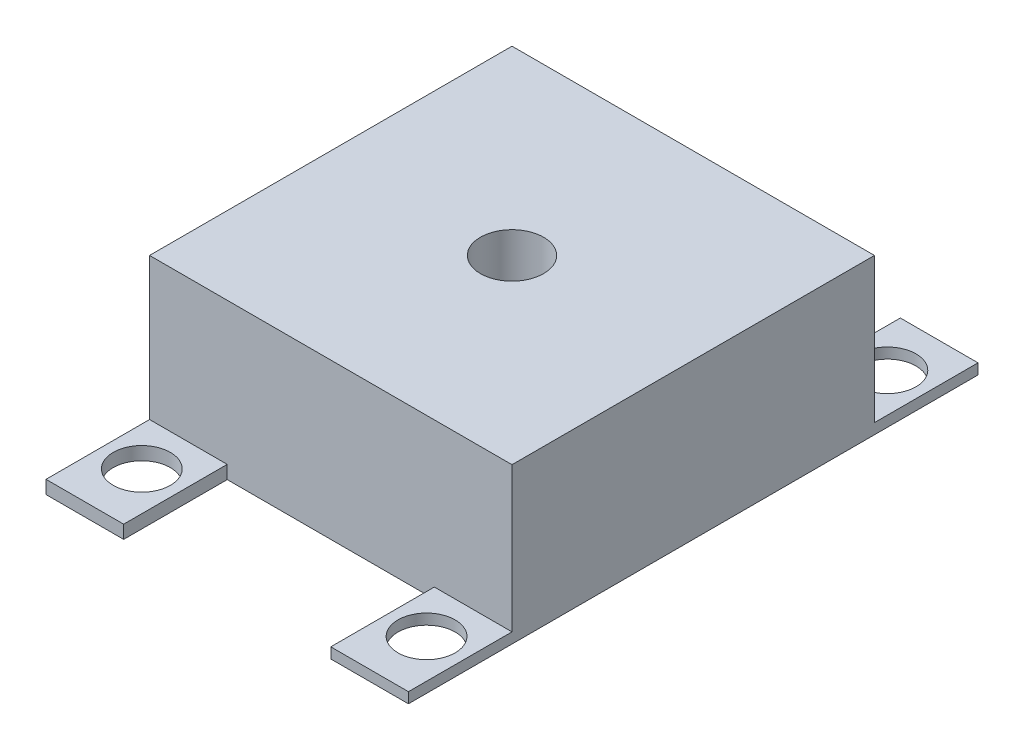
ISO-10303-21;
HEADER;
FILE_DESCRIPTION(('STEP AP214'),'2;1');
FILE_NAME('part.step','',(''),(''),'','','');
FILE_SCHEMA(('AUTOMOTIVE_DESIGN { 1 0 10303 214 1 1 1 1 }'));
ENDSEC;
DATA;
#1=APPLICATION_CONTEXT('core data for automotive mechanical design processes');
#2=APPLICATION_PROTOCOL_DEFINITION('international standard','automotive_design',2000,#1);
#3=PRODUCT_CONTEXT('',#1,'mechanical');
#4=PRODUCT('Part','Part','',(#3));
#5=PRODUCT_RELATED_PRODUCT_CATEGORY('part','',(#4));
#6=PRODUCT_DEFINITION_FORMATION('','',#4);
#7=PRODUCT_DEFINITION_CONTEXT('part definition',#1,'design');
#8=PRODUCT_DEFINITION('design','',#6,#7);
#9=PRODUCT_DEFINITION_SHAPE('','',#8);
#10=(LENGTH_UNIT() NAMED_UNIT(*) SI_UNIT(.MILLI.,.METRE.));
#11=(NAMED_UNIT(*) PLANE_ANGLE_UNIT() SI_UNIT($,.RADIAN.));
#12=(NAMED_UNIT(*) SI_UNIT($,.STERADIAN.) SOLID_ANGLE_UNIT());
#13=UNCERTAINTY_MEASURE_WITH_UNIT(LENGTH_MEASURE(1.E-05),#10,'distance_accuracy_value','');
#14=(GEOMETRIC_REPRESENTATION_CONTEXT(3) GLOBAL_UNCERTAINTY_ASSIGNED_CONTEXT((#13)) GLOBAL_UNIT_ASSIGNED_CONTEXT((#10,
#11,#12)) REPRESENTATION_CONTEXT('',''));
#15=CARTESIAN_POINT('',(0.,0.,0.));
#16=DIRECTION('',(0.,0.,1.));
#17=DIRECTION('',(1.,0.,0.));
#18=AXIS2_PLACEMENT_3D('',#15,#16,#17);
#19=CARTESIAN_POINT('',(17.5,40.,-17.5));
#20=DIRECTION('',(-1.,0.,0.));
#21=DIRECTION('',(0.,0.,1.));
#22=AXIS2_PLACEMENT_3D('',#19,#20,#21);
#23=PLANE('',#22);
#24=DIRECTION('',(0.,-1.,0.));
#25=VECTOR('',#24,1.);
#26=CARTESIAN_POINT('',(17.5,40.,17.5));
#27=LINE('',#26,#25);
#28=CARTESIAN_POINT('',(17.5,40.,17.5));
#29=VERTEX_POINT('',#28);
#30=CARTESIAN_POINT('',(17.5,26.0178431332996,17.5));
#31=VERTEX_POINT('',#30);
#32=EDGE_CURVE('E260',#29,#31,#27,.T.);
#33=ORIENTED_EDGE('',*,*,#32,.T.);
#34=DIRECTION('',(0.,0.,-1.));
#35=VECTOR('',#34,1.);
#36=CARTESIAN_POINT('',(17.5,26.0178431332996,27.5));
#37=LINE('',#36,#35);
#38=CARTESIAN_POINT('',(17.5,26.0178431332996,27.5));
#39=VERTEX_POINT('',#38);
#40=EDGE_CURVE('E228',#39,#31,#37,.T.);
#41=ORIENTED_EDGE('',*,*,#40,.F.);
#42=DIRECTION('',(0.,-1.,0.));
#43=VECTOR('',#42,1.);
#44=CARTESIAN_POINT('',(17.5,25.,27.5));
#45=LINE('',#44,#43);
#46=CARTESIAN_POINT('',(17.5,25.,27.5));
#47=VERTEX_POINT('',#46);
#48=EDGE_CURVE('E215',#39,#47,#45,.T.);
#49=ORIENTED_EDGE('',*,*,#48,.T.);
#50=DIRECTION('',(0.,0.,-1.));
#51=VECTOR('',#50,1.);
#52=CARTESIAN_POINT('',(17.5,25.,-17.5));
#53=LINE('',#52,#51);
#54=CARTESIAN_POINT('',(17.5,25.,-27.5));
#55=VERTEX_POINT('',#54);
#56=EDGE_CURVE('E261',#47,#55,#53,.T.);
#57=ORIENTED_EDGE('',*,*,#56,.T.);
#58=DIRECTION('',(0.,-1.,0.));
#59=VECTOR('',#58,1.);
#60=CARTESIAN_POINT('',(17.5,25.,-27.5));
#61=LINE('',#60,#59);
#62=CARTESIAN_POINT('',(17.5,26.0178431332996,-27.5));
#63=VERTEX_POINT('',#62);
#64=EDGE_CURVE('E203',#63,#55,#61,.T.);
#65=ORIENTED_EDGE('',*,*,#64,.F.);
#66=CARTESIAN_POINT('',(17.5,26.0178431332996,-17.5));
#67=VERTEX_POINT('',#66);
#68=EDGE_CURVE('E232',#67,#63,#37,.T.);
#69=ORIENTED_EDGE('',*,*,#68,.F.);
#70=DIRECTION('',(0.,-1.,0.));
#71=VECTOR('',#70,1.);
#72=CARTESIAN_POINT('',(17.5,40.,-17.5));
#73=LINE('',#72,#71);
#74=CARTESIAN_POINT('',(17.5,40.,-17.5));
#75=VERTEX_POINT('',#74);
#76=EDGE_CURVE('E275',#75,#67,#73,.T.);
#77=ORIENTED_EDGE('',*,*,#76,.F.);
#78=DIRECTION('',(0.,0.,-1.));
#79=VECTOR('',#78,1.);
#80=CARTESIAN_POINT('',(17.5,40.,-17.5));
#81=LINE('',#80,#79);
#82=EDGE_CURVE('E250',#29,#75,#81,.T.);
#83=ORIENTED_EDGE('',*,*,#82,.F.);
#84=EDGE_LOOP('',(#33,#41,#49,#57,#65,#69,#77,#83));
#85=FACE_BOUND('',#84,.T.);
#86=ADVANCED_FACE('F35',(#85),#23,.F.);
#87=CARTESIAN_POINT('',(-17.5,40.,-17.5));
#88=DIRECTION('',(0.,0.,1.));
#89=DIRECTION('',(1.,0.,0.));
#90=AXIS2_PLACEMENT_3D('',#87,#88,#89);
#91=PLANE('',#90);
#92=DIRECTION('',(-1.,0.,0.));
#93=VECTOR('',#92,1.);
#94=CARTESIAN_POINT('',(-17.5,25.,-17.5));
#95=LINE('',#94,#93);
#96=CARTESIAN_POINT('',(10.,25.,-17.5));
#97=VERTEX_POINT('',#96);
#98=CARTESIAN_POINT('',(-10.,25.,-17.5));
#99=VERTEX_POINT('',#98);
#100=EDGE_CURVE('E263',#97,#99,#95,.T.);
#101=ORIENTED_EDGE('',*,*,#100,.T.);
#102=DIRECTION('',(0.,1.,0.));
#103=VECTOR('',#102,1.);
#104=CARTESIAN_POINT('',(-10.,40.,-17.5));
#105=LINE('',#104,#103);
#106=CARTESIAN_POINT('',(-10.,26.2761833000056,-17.5));
#107=VERTEX_POINT('',#106);
#108=EDGE_CURVE('E198',#99,#107,#105,.T.);
#109=ORIENTED_EDGE('',*,*,#108,.T.);
#110=DIRECTION('',(-1.,0.,0.));
#111=VECTOR('',#110,1.);
#112=CARTESIAN_POINT('',(-17.5,26.2761833000056,-17.5));
#113=LINE('',#112,#111);
#114=CARTESIAN_POINT('',(-17.5,26.2761833000056,-17.5));
#115=VERTEX_POINT('',#114);
#116=EDGE_CURVE('E201',#107,#115,#113,.T.);
#117=ORIENTED_EDGE('',*,*,#116,.T.);
#118=DIRECTION('',(0.,-1.,0.));
#119=VECTOR('',#118,1.);
#120=CARTESIAN_POINT('',(-17.5,40.,-17.5));
#121=LINE('',#120,#119);
#122=CARTESIAN_POINT('',(-17.5,40.,-17.5));
#123=VERTEX_POINT('',#122);
#124=EDGE_CURVE('E154',#123,#115,#121,.T.);
#125=ORIENTED_EDGE('',*,*,#124,.F.);
#126=DIRECTION('',(-1.,0.,0.));
#127=VECTOR('',#126,1.);
#128=CARTESIAN_POINT('',(-17.5,40.,-17.5));
#129=LINE('',#128,#127);
#130=EDGE_CURVE('E253',#75,#123,#129,.T.);
#131=ORIENTED_EDGE('',*,*,#130,.F.);
#132=ORIENTED_EDGE('',*,*,#76,.T.);
#133=DIRECTION('',(-1.,0.,0.));
#134=VECTOR('',#133,1.);
#135=CARTESIAN_POINT('',(-17.5,26.0178431332996,-17.5));
#136=LINE('',#135,#134);
#137=CARTESIAN_POINT('',(10.,26.0178431332996,-17.5));
#138=VERTEX_POINT('',#137);
#139=EDGE_CURVE('E244',#67,#138,#136,.T.);
#140=ORIENTED_EDGE('',*,*,#139,.T.);
#141=DIRECTION('',(0.,-1.,0.));
#142=VECTOR('',#141,1.);
#143=CARTESIAN_POINT('',(10.,40.,-17.5));
#144=LINE('',#143,#142);
#145=EDGE_CURVE('E241',#138,#97,#144,.T.);
#146=ORIENTED_EDGE('',*,*,#145,.T.);
#147=EDGE_LOOP('',(#101,#109,#117,#125,#131,#132,#140,#146));
#148=FACE_BOUND('',#147,.T.);
#149=ADVANCED_FACE('F321',(#148),#91,.F.);
#150=CARTESIAN_POINT('',(-17.5,40.,-17.5));
#151=DIRECTION('',(1.,0.,0.));
#152=DIRECTION('',(0.,0.,-1.));
#153=AXIS2_PLACEMENT_3D('',#150,#151,#152);
#154=PLANE('',#153);
#155=ORIENTED_EDGE('',*,*,#124,.T.);
#156=DIRECTION('',(0.,0.,-1.));
#157=VECTOR('',#156,1.);
#158=CARTESIAN_POINT('',(-17.5,26.2761833000056,27.5));
#159=LINE('',#158,#157);
#160=CARTESIAN_POINT('',(-17.5,26.2761833000056,-27.5));
#161=VERTEX_POINT('',#160);
#162=EDGE_CURVE('E51',#115,#161,#159,.T.);
#163=ORIENTED_EDGE('',*,*,#162,.T.);
#164=DIRECTION('',(0.,1.,0.));
#165=VECTOR('',#164,1.);
#166=CARTESIAN_POINT('',(-17.5,25.,-27.5));
#167=LINE('',#166,#165);
#168=CARTESIAN_POINT('',(-17.5,25.,-27.5));
#169=VERTEX_POINT('',#168);
#170=EDGE_CURVE('E151',#169,#161,#167,.T.);
#171=ORIENTED_EDGE('',*,*,#170,.F.);
#172=DIRECTION('',(0.,0.,1.));
#173=VECTOR('',#172,1.);
#174=CARTESIAN_POINT('',(-17.5,25.,-17.5));
#175=LINE('',#174,#173);
#176=CARTESIAN_POINT('',(-17.5,25.,27.5));
#177=VERTEX_POINT('',#176);
#178=EDGE_CURVE('E266',#169,#177,#175,.T.);
#179=ORIENTED_EDGE('',*,*,#178,.T.);
#180=DIRECTION('',(0.,1.,0.));
#181=VECTOR('',#180,1.);
#182=CARTESIAN_POINT('',(-17.5,25.,27.5));
#183=LINE('',#182,#181);
#184=CARTESIAN_POINT('',(-17.5,26.2761833000056,27.5));
#185=VERTEX_POINT('',#184);
#186=EDGE_CURVE('E180',#177,#185,#183,.T.);
#187=ORIENTED_EDGE('',*,*,#186,.T.);
#188=CARTESIAN_POINT('',(-17.5,26.2761833000056,17.5));
#189=VERTEX_POINT('',#188);
#190=EDGE_CURVE('E155',#185,#189,#159,.T.);
#191=ORIENTED_EDGE('',*,*,#190,.T.);
#192=DIRECTION('',(0.,-1.,0.));
#193=VECTOR('',#192,1.);
#194=CARTESIAN_POINT('',(-17.5,40.,17.5));
#195=LINE('',#194,#193);
#196=CARTESIAN_POINT('',(-17.5,40.,17.5));
#197=VERTEX_POINT('',#196);
#198=EDGE_CURVE('E271',#197,#189,#195,.T.);
#199=ORIENTED_EDGE('',*,*,#198,.F.);
#200=DIRECTION('',(0.,0.,1.));
#201=VECTOR('',#200,1.);
#202=CARTESIAN_POINT('',(-17.5,40.,-17.5));
#203=LINE('',#202,#201);
#204=EDGE_CURVE('E256',#123,#197,#203,.T.);
#205=ORIENTED_EDGE('',*,*,#204,.F.);
#206=EDGE_LOOP('',(#155,#163,#171,#179,#187,#191,#199,#205));
#207=FACE_BOUND('',#206,.T.);
#208=ADVANCED_FACE('F149',(#207),#154,.F.);
#209=CARTESIAN_POINT('',(-17.5,40.,17.5));
#210=DIRECTION('',(0.,0.,-1.));
#211=DIRECTION('',(-1.,0.,0.));
#212=AXIS2_PLACEMENT_3D('',#209,#210,#211);
#213=PLANE('',#212);
#214=DIRECTION('',(1.,0.,0.));
#215=VECTOR('',#214,1.);
#216=CARTESIAN_POINT('',(-17.5,26.2761833000056,17.5));
#217=LINE('',#216,#215);
#218=CARTESIAN_POINT('',(-10.,26.2761833000056,17.5));
#219=VERTEX_POINT('',#218);
#220=EDGE_CURVE('E11',#189,#219,#217,.T.);
#221=ORIENTED_EDGE('',*,*,#220,.T.);
#222=DIRECTION('',(0.,-1.,0.));
#223=VECTOR('',#222,1.);
#224=CARTESIAN_POINT('',(-10.,40.,17.5));
#225=LINE('',#224,#223);
#226=CARTESIAN_POINT('',(-10.,25.,17.5));
#227=VERTEX_POINT('',#226);
#228=EDGE_CURVE('E192',#219,#227,#225,.T.);
#229=ORIENTED_EDGE('',*,*,#228,.T.);
#230=DIRECTION('',(1.,0.,0.));
#231=VECTOR('',#230,1.);
#232=CARTESIAN_POINT('',(-17.5,25.,17.5));
#233=LINE('',#232,#231);
#234=CARTESIAN_POINT('',(10.,25.,17.5));
#235=VERTEX_POINT('',#234);
#236=EDGE_CURVE('E254',#227,#235,#233,.T.);
#237=ORIENTED_EDGE('',*,*,#236,.T.);
#238=DIRECTION('',(0.,1.,0.));
#239=VECTOR('',#238,1.);
#240=CARTESIAN_POINT('',(10.,40.,17.5));
#241=LINE('',#240,#239);
#242=CARTESIAN_POINT('',(10.,26.0178431332996,17.5));
#243=VERTEX_POINT('',#242);
#244=EDGE_CURVE('E231',#235,#243,#241,.T.);
#245=ORIENTED_EDGE('',*,*,#244,.T.);
#246=DIRECTION('',(1.,0.,0.));
#247=VECTOR('',#246,1.);
#248=CARTESIAN_POINT('',(-17.5,26.0178431332996,17.5));
#249=LINE('',#248,#247);
#250=EDGE_CURVE('E43',#243,#31,#249,.T.);
#251=ORIENTED_EDGE('',*,*,#250,.T.);
#252=ORIENTED_EDGE('',*,*,#32,.F.);
#253=DIRECTION('',(1.,0.,0.));
#254=VECTOR('',#253,1.);
#255=CARTESIAN_POINT('',(-17.5,40.,17.5));
#256=LINE('',#255,#254);
#257=EDGE_CURVE('E258',#197,#29,#256,.T.);
#258=ORIENTED_EDGE('',*,*,#257,.F.);
#259=ORIENTED_EDGE('',*,*,#198,.T.);
#260=EDGE_LOOP('',(#221,#229,#237,#245,#251,#252,#258,#259));
#261=FACE_BOUND('',#260,.T.);
#262=ADVANCED_FACE('F314',(#261),#213,.F.);
#263=CARTESIAN_POINT('',(0.,40.,0.));
#264=DIRECTION('',(0.,1.,0.));
#265=DIRECTION('',(0.,0.,1.));
#266=AXIS2_PLACEMENT_3D('',#263,#264,#265);
#267=PLANE('',#266);
#268=CARTESIAN_POINT('',(0.,40.,0.));
#269=DIRECTION('',(0.,1.,0.));
#270=DIRECTION('',(0.,0.,1.));
#271=AXIS2_PLACEMENT_3D('',#268,#269,#270);
#272=CIRCLE('',#271,3.05);
#273=CARTESIAN_POINT('',(0.,40.,3.05));
#274=VERTEX_POINT('',#273);
#275=EDGE_CURVE('E246',#274,#274,#272,.T.);
#276=ORIENTED_EDGE('',*,*,#275,.F.);
#277=EDGE_LOOP('',(#276));
#278=FACE_BOUND('',#277,.T.);
#279=ORIENTED_EDGE('',*,*,#82,.T.);
#280=ORIENTED_EDGE('',*,*,#130,.T.);
#281=ORIENTED_EDGE('',*,*,#204,.T.);
#282=ORIENTED_EDGE('',*,*,#257,.T.);
#283=EDGE_LOOP('',(#279,#280,#281,#282));
#284=FACE_BOUND('',#283,.T.);
#285=ADVANCED_FACE('F318',(#278,#284),#267,.T.);
#286=CARTESIAN_POINT('',(0.,25.,0.));
#287=DIRECTION('',(0.,1.,0.));
#288=DIRECTION('',(0.,0.,1.));
#289=AXIS2_PLACEMENT_3D('',#286,#287,#288);
#290=PLANE('',#289);
#291=CARTESIAN_POINT('',(-13.7499999999995,25.,22.));
#292=DIRECTION('',(0.,1.,0.));
#293=DIRECTION('',(0.,0.,1.));
#294=AXIS2_PLACEMENT_3D('',#291,#292,#293);
#295=CIRCLE('',#294,2.76);
#296=CARTESIAN_POINT('',(-13.7499999999995,25.,24.76));
#297=VERTEX_POINT('',#296);
#298=EDGE_CURVE('E282',#297,#297,#295,.T.);
#299=ORIENTED_EDGE('',*,*,#298,.T.);
#300=EDGE_LOOP('',(#299));
#301=FACE_BOUND('',#300,.T.);
#302=CARTESIAN_POINT('',(13.75,25.,-22.5));
#303=DIRECTION('',(0.,1.,0.));
#304=DIRECTION('',(0.,0.,1.));
#305=AXIS2_PLACEMENT_3D('',#302,#303,#304);
#306=CIRCLE('',#305,2.76);
#307=CARTESIAN_POINT('',(13.75,25.,-19.74));
#308=VERTEX_POINT('',#307);
#309=EDGE_CURVE('E281',#308,#308,#306,.T.);
#310=ORIENTED_EDGE('',*,*,#309,.T.);
#311=EDGE_LOOP('',(#310));
#312=FACE_BOUND('',#311,.T.);
#313=CARTESIAN_POINT('',(13.7500000000005,25.,22.));
#314=DIRECTION('',(0.,1.,0.));
#315=DIRECTION('',(0.,0.,1.));
#316=AXIS2_PLACEMENT_3D('',#313,#314,#315);
#317=CIRCLE('',#316,2.76);
#318=CARTESIAN_POINT('',(13.7500000000005,25.,24.76));
#319=VERTEX_POINT('',#318);
#320=EDGE_CURVE('E172',#319,#319,#317,.T.);
#321=ORIENTED_EDGE('',*,*,#320,.T.);
#322=EDGE_LOOP('',(#321));
#323=FACE_BOUND('',#322,.T.);
#324=CARTESIAN_POINT('',(-13.75,25.,-22.5));
#325=DIRECTION('',(0.,1.,0.));
#326=DIRECTION('',(0.,0.,1.));
#327=AXIS2_PLACEMENT_3D('',#324,#325,#326);
#328=CIRCLE('',#327,2.76);
#329=CARTESIAN_POINT('',(-13.75,25.,-19.74));
#330=VERTEX_POINT('',#329);
#331=EDGE_CURVE('E287',#330,#330,#328,.T.);
#332=ORIENTED_EDGE('',*,*,#331,.T.);
#333=EDGE_LOOP('',(#332));
#334=FACE_BOUND('',#333,.T.);
#335=CARTESIAN_POINT('',(0.,25.,0.));
#336=DIRECTION('',(0.,1.,0.));
#337=DIRECTION('',(0.,0.,1.));
#338=AXIS2_PLACEMENT_3D('',#335,#336,#337);
#339=CIRCLE('',#338,3.05);
#340=CARTESIAN_POINT('',(0.,25.,3.05));
#341=VERTEX_POINT('',#340);
#342=EDGE_CURVE('E249',#341,#341,#339,.T.);
#343=ORIENTED_EDGE('',*,*,#342,.T.);
#344=EDGE_LOOP('',(#343));
#345=FACE_BOUND('',#344,.T.);
#346=ORIENTED_EDGE('',*,*,#236,.F.);
#347=DIRECTION('',(0.,0.,-1.));
#348=VECTOR('',#347,1.);
#349=CARTESIAN_POINT('',(-10.,25.,27.5));
#350=LINE('',#349,#348);
#351=CARTESIAN_POINT('',(-10.,25.,27.5));
#352=VERTEX_POINT('',#351);
#353=EDGE_CURVE('E190',#352,#227,#350,.T.);
#354=ORIENTED_EDGE('',*,*,#353,.F.);
#355=DIRECTION('',(-1.,0.,0.));
#356=VECTOR('',#355,1.);
#357=CARTESIAN_POINT('',(-17.5,25.,27.5));
#358=LINE('',#357,#356);
#359=EDGE_CURVE('E156',#352,#177,#358,.T.);
#360=ORIENTED_EDGE('',*,*,#359,.T.);
#361=ORIENTED_EDGE('',*,*,#178,.F.);
#362=DIRECTION('',(-1.,0.,0.));
#363=VECTOR('',#362,1.);
#364=CARTESIAN_POINT('',(-17.5,25.,-27.5));
#365=LINE('',#364,#363);
#366=CARTESIAN_POINT('',(-10.,25.,-27.5));
#367=VERTEX_POINT('',#366);
#368=EDGE_CURVE('E171',#367,#169,#365,.T.);
#369=ORIENTED_EDGE('',*,*,#368,.F.);
#370=EDGE_CURVE('E193',#99,#367,#350,.T.);
#371=ORIENTED_EDGE('',*,*,#370,.F.);
#372=ORIENTED_EDGE('',*,*,#100,.F.);
#373=DIRECTION('',(0.,0.,-1.));
#374=VECTOR('',#373,1.);
#375=CARTESIAN_POINT('',(10.,25.,27.5));
#376=LINE('',#375,#374);
#377=CARTESIAN_POINT('',(10.,25.,-27.5));
#378=VERTEX_POINT('',#377);
#379=EDGE_CURVE('E227',#97,#378,#376,.T.);
#380=ORIENTED_EDGE('',*,*,#379,.T.);
#381=DIRECTION('',(-1.,0.,0.));
#382=VECTOR('',#381,1.);
#383=CARTESIAN_POINT('',(17.5,25.,-27.5));
#384=LINE('',#383,#382);
#385=EDGE_CURVE('E206',#55,#378,#384,.T.);
#386=ORIENTED_EDGE('',*,*,#385,.F.);
#387=ORIENTED_EDGE('',*,*,#56,.F.);
#388=DIRECTION('',(-1.,0.,0.));
#389=VECTOR('',#388,1.);
#390=CARTESIAN_POINT('',(17.5,25.,27.5));
#391=LINE('',#390,#389);
#392=CARTESIAN_POINT('',(10.,25.,27.5));
#393=VERTEX_POINT('',#392);
#394=EDGE_CURVE('E218',#47,#393,#391,.T.);
#395=ORIENTED_EDGE('',*,*,#394,.T.);
#396=EDGE_CURVE('E237',#393,#235,#376,.T.);
#397=ORIENTED_EDGE('',*,*,#396,.T.);
#398=EDGE_LOOP('',(#346,#354,#360,#361,#369,#371,#372,#380,#386,#387,#395,#397));
#399=FACE_BOUND('',#398,.T.);
#400=ADVANCED_FACE('F327',(#301,#312,#323,#334,#345,#399),#290,.F.);
#401=CARTESIAN_POINT('',(0.,-8.62670273047587,0.));
#402=DIRECTION('',(0.,1.,0.));
#403=DIRECTION('',(0.,0.,1.));
#404=AXIS2_PLACEMENT_3D('',#401,#402,#403);
#405=CYLINDRICAL_SURFACE('',#404,3.05);
#406=ORIENTED_EDGE('',*,*,#275,.T.);
#407=EDGE_LOOP('',(#406));
#408=FACE_BOUND('',#407,.T.);
#409=ORIENTED_EDGE('',*,*,#342,.F.);
#410=EDGE_LOOP('',(#409));
#411=FACE_BOUND('',#410,.T.);
#412=ADVANCED_FACE('F382',(#408,#411),#405,.F.);
#413=CARTESIAN_POINT('',(0.,0.,27.5));
#414=DIRECTION('',(0.,0.,1.));
#415=DIRECTION('',(1.,0.,0.));
#416=AXIS2_PLACEMENT_3D('',#413,#414,#415);
#417=PLANE('',#416);
#418=ORIENTED_EDGE('',*,*,#48,.F.);
#419=DIRECTION('',(1.,0.,0.));
#420=VECTOR('',#419,1.);
#421=CARTESIAN_POINT('',(17.5,26.0178431332996,27.5));
#422=LINE('',#421,#420);
#423=CARTESIAN_POINT('',(10.,26.0178431332996,27.5));
#424=VERTEX_POINT('',#423);
#425=EDGE_CURVE('E224',#424,#39,#422,.T.);
#426=ORIENTED_EDGE('',*,*,#425,.F.);
#427=DIRECTION('',(0.,1.,0.));
#428=VECTOR('',#427,1.);
#429=CARTESIAN_POINT('',(10.,25.,27.5));
#430=LINE('',#429,#428);
#431=EDGE_CURVE('E221',#393,#424,#430,.T.);
#432=ORIENTED_EDGE('',*,*,#431,.F.);
#433=ORIENTED_EDGE('',*,*,#394,.F.);
#434=EDGE_LOOP('',(#418,#426,#432,#433));
#435=FACE_BOUND('',#434,.T.);
#436=ADVANCED_FACE('F340',(#435),#417,.T.);
#437=CARTESIAN_POINT('',(10.,25.,27.5));
#438=DIRECTION('',(-1.,0.,0.));
#439=DIRECTION('',(0.,0.,1.));
#440=AXIS2_PLACEMENT_3D('',#437,#438,#439);
#441=PLANE('',#440);
#442=ORIENTED_EDGE('',*,*,#244,.F.);
#443=ORIENTED_EDGE('',*,*,#396,.F.);
#444=ORIENTED_EDGE('',*,*,#431,.T.);
#445=DIRECTION('',(0.,0.,-1.));
#446=VECTOR('',#445,1.);
#447=CARTESIAN_POINT('',(10.,26.0178431332996,27.5));
#448=LINE('',#447,#446);
#449=EDGE_CURVE('E233',#424,#243,#448,.T.);
#450=ORIENTED_EDGE('',*,*,#449,.T.);
#451=EDGE_LOOP('',(#442,#443,#444,#450));
#452=FACE_BOUND('',#451,.T.);
#453=ADVANCED_FACE('F336',(#452),#441,.T.);
#454=CARTESIAN_POINT('',(17.5,26.0178431332996,27.5));
#455=DIRECTION('',(0.,1.,0.));
#456=DIRECTION('',(0.,0.,1.));
#457=AXIS2_PLACEMENT_3D('',#454,#455,#456);
#458=PLANE('',#457);
#459=CARTESIAN_POINT('',(13.7500000000005,26.0178431332996,22.));
#460=DIRECTION('',(0.,1.,0.));
#461=DIRECTION('',(0.,0.,1.));
#462=AXIS2_PLACEMENT_3D('',#459,#460,#461);
#463=CIRCLE('',#462,2.76);
#464=CARTESIAN_POINT('',(13.7500000000005,26.0178431332996,24.76));
#465=VERTEX_POINT('',#464);
#466=EDGE_CURVE('E38',#465,#465,#463,.T.);
#467=ORIENTED_EDGE('',*,*,#466,.F.);
#468=EDGE_LOOP('',(#467));
#469=FACE_BOUND('',#468,.T.);
#470=ORIENTED_EDGE('',*,*,#250,.F.);
#471=ORIENTED_EDGE('',*,*,#449,.F.);
#472=ORIENTED_EDGE('',*,*,#425,.T.);
#473=ORIENTED_EDGE('',*,*,#40,.T.);
#474=EDGE_LOOP('',(#470,#471,#472,#473));
#475=FACE_BOUND('',#474,.T.);
#476=ADVANCED_FACE('F343',(#469,#475),#458,.T.);
#477=CARTESIAN_POINT('',(13.75,26.0178431332996,-22.5));
#478=DIRECTION('',(0.,1.,0.));
#479=DIRECTION('',(0.,0.,1.));
#480=AXIS2_PLACEMENT_3D('',#477,#478,#479);
#481=CIRCLE('',#480,2.76);
#482=CARTESIAN_POINT('',(13.75,26.0178431332996,-19.74));
#483=VERTEX_POINT('',#482);
#484=EDGE_CURVE('E279',#483,#483,#481,.T.);
#485=ORIENTED_EDGE('',*,*,#484,.F.);
#486=EDGE_LOOP('',(#485));
#487=FACE_BOUND('',#486,.T.);
#488=ORIENTED_EDGE('',*,*,#139,.F.);
#489=ORIENTED_EDGE('',*,*,#68,.T.);
#490=DIRECTION('',(1.,0.,0.));
#491=VECTOR('',#490,1.);
#492=CARTESIAN_POINT('',(17.5,26.0178431332996,-27.5));
#493=LINE('',#492,#491);
#494=CARTESIAN_POINT('',(10.,26.0178431332996,-27.5));
#495=VERTEX_POINT('',#494);
#496=EDGE_CURVE('E212',#495,#63,#493,.T.);
#497=ORIENTED_EDGE('',*,*,#496,.F.);
#498=EDGE_CURVE('E236',#138,#495,#448,.T.);
#499=ORIENTED_EDGE('',*,*,#498,.F.);
#500=EDGE_LOOP('',(#488,#489,#497,#499));
#501=FACE_BOUND('',#500,.T.);
#502=ADVANCED_FACE('F351',(#487,#501),#458,.T.);
#503=ORIENTED_EDGE('',*,*,#145,.F.);
#504=ORIENTED_EDGE('',*,*,#498,.T.);
#505=DIRECTION('',(0.,1.,0.));
#506=VECTOR('',#505,1.);
#507=CARTESIAN_POINT('',(10.,25.,-27.5));
#508=LINE('',#507,#506);
#509=EDGE_CURVE('E209',#378,#495,#508,.T.);
#510=ORIENTED_EDGE('',*,*,#509,.F.);
#511=ORIENTED_EDGE('',*,*,#379,.F.);
#512=EDGE_LOOP('',(#503,#504,#510,#511));
#513=FACE_BOUND('',#512,.T.);
#514=ADVANCED_FACE('F355',(#513),#441,.T.);
#515=CARTESIAN_POINT('',(0.,0.,-27.5));
#516=DIRECTION('',(0.,0.,1.));
#517=DIRECTION('',(1.,0.,0.));
#518=AXIS2_PLACEMENT_3D('',#515,#516,#517);
#519=PLANE('',#518);
#520=ORIENTED_EDGE('',*,*,#64,.T.);
#521=ORIENTED_EDGE('',*,*,#385,.T.);
#522=ORIENTED_EDGE('',*,*,#509,.T.);
#523=ORIENTED_EDGE('',*,*,#496,.T.);
#524=EDGE_LOOP('',(#520,#521,#522,#523));
#525=FACE_BOUND('',#524,.T.);
#526=ADVANCED_FACE('F358',(#525),#519,.F.);
#527=CARTESIAN_POINT('',(0.,0.,27.5));
#528=DIRECTION('',(0.,0.,-1.));
#529=DIRECTION('',(-1.,0.,0.));
#530=AXIS2_PLACEMENT_3D('',#527,#528,#529);
#531=PLANE('',#530);
#532=ORIENTED_EDGE('',*,*,#186,.F.);
#533=ORIENTED_EDGE('',*,*,#359,.F.);
#534=DIRECTION('',(0.,-1.,0.));
#535=VECTOR('',#534,1.);
#536=CARTESIAN_POINT('',(-10.,25.,27.5));
#537=LINE('',#536,#535);
#538=CARTESIAN_POINT('',(-10.,26.2761833000056,27.5));
#539=VERTEX_POINT('',#538);
#540=EDGE_CURVE('E185',#539,#352,#537,.T.);
#541=ORIENTED_EDGE('',*,*,#540,.F.);
#542=DIRECTION('',(1.,0.,0.));
#543=VECTOR('',#542,1.);
#544=CARTESIAN_POINT('',(-17.5,26.2761833000056,27.5));
#545=LINE('',#544,#543);
#546=EDGE_CURVE('E183',#185,#539,#545,.T.);
#547=ORIENTED_EDGE('',*,*,#546,.F.);
#548=EDGE_LOOP('',(#532,#533,#541,#547));
#549=FACE_BOUND('',#548,.T.);
#550=ADVANCED_FACE('F307',(#549),#531,.F.);
#551=CARTESIAN_POINT('',(-17.5,26.2761833000056,27.5));
#552=DIRECTION('',(0.,1.,0.));
#553=DIRECTION('',(0.,0.,1.));
#554=AXIS2_PLACEMENT_3D('',#551,#552,#553);
#555=PLANE('',#554);
#556=CARTESIAN_POINT('',(-13.7499999999995,26.2761833000056,22.));
#557=DIRECTION('',(0.,1.,0.));
#558=DIRECTION('',(0.,0.,1.));
#559=AXIS2_PLACEMENT_3D('',#556,#557,#558);
#560=CIRCLE('',#559,2.76);
#561=CARTESIAN_POINT('',(-13.7499999999995,26.2761833000056,24.76));
#562=VERTEX_POINT('',#561);
#563=EDGE_CURVE('E297',#562,#562,#560,.T.);
#564=ORIENTED_EDGE('',*,*,#563,.F.);
#565=EDGE_LOOP('',(#564));
#566=FACE_BOUND('',#565,.T.);
#567=ORIENTED_EDGE('',*,*,#220,.F.);
#568=ORIENTED_EDGE('',*,*,#190,.F.);
#569=ORIENTED_EDGE('',*,*,#546,.T.);
#570=DIRECTION('',(0.,0.,-1.));
#571=VECTOR('',#570,1.);
#572=CARTESIAN_POINT('',(-10.,26.2761833000056,27.5));
#573=LINE('',#572,#571);
#574=EDGE_CURVE('E59',#539,#219,#573,.T.);
#575=ORIENTED_EDGE('',*,*,#574,.T.);
#576=EDGE_LOOP('',(#567,#568,#569,#575));
#577=FACE_BOUND('',#576,.T.);
#578=ADVANCED_FACE('F304',(#566,#577),#555,.T.);
#579=CARTESIAN_POINT('',(-10.,25.,27.5));
#580=DIRECTION('',(1.,0.,0.));
#581=DIRECTION('',(0.,0.,-1.));
#582=AXIS2_PLACEMENT_3D('',#579,#580,#581);
#583=PLANE('',#582);
#584=ORIENTED_EDGE('',*,*,#228,.F.);
#585=ORIENTED_EDGE('',*,*,#574,.F.);
#586=ORIENTED_EDGE('',*,*,#540,.T.);
#587=ORIENTED_EDGE('',*,*,#353,.T.);
#588=EDGE_LOOP('',(#584,#585,#586,#587));
#589=FACE_BOUND('',#588,.T.);
#590=ADVANCED_FACE('F306',(#589),#583,.T.);
#591=CARTESIAN_POINT('',(-13.75,26.2761833000056,-22.5));
#592=DIRECTION('',(0.,1.,0.));
#593=DIRECTION('',(0.,0.,1.));
#594=AXIS2_PLACEMENT_3D('',#591,#592,#593);
#595=CIRCLE('',#594,2.76);
#596=CARTESIAN_POINT('',(-13.75,26.2761833000056,-19.74));
#597=VERTEX_POINT('',#596);
#598=EDGE_CURVE('E292',#597,#597,#595,.T.);
#599=ORIENTED_EDGE('',*,*,#598,.F.);
#600=EDGE_LOOP('',(#599));
#601=FACE_BOUND('',#600,.T.);
#602=ORIENTED_EDGE('',*,*,#116,.F.);
#603=CARTESIAN_POINT('',(-10.,26.2761833000056,-27.5));
#604=VERTEX_POINT('',#603);
#605=EDGE_CURVE('E162',#107,#604,#573,.T.);
#606=ORIENTED_EDGE('',*,*,#605,.T.);
#607=DIRECTION('',(1.,0.,0.));
#608=VECTOR('',#607,1.);
#609=CARTESIAN_POINT('',(-17.5,26.2761833000056,-27.5));
#610=LINE('',#609,#608);
#611=EDGE_CURVE('E159',#161,#604,#610,.T.);
#612=ORIENTED_EDGE('',*,*,#611,.F.);
#613=ORIENTED_EDGE('',*,*,#162,.F.);
#614=EDGE_LOOP('',(#602,#606,#612,#613));
#615=FACE_BOUND('',#614,.T.);
#616=ADVANCED_FACE('F160',(#601,#615),#555,.T.);
#617=ORIENTED_EDGE('',*,*,#108,.F.);
#618=ORIENTED_EDGE('',*,*,#370,.T.);
#619=DIRECTION('',(0.,-1.,0.));
#620=VECTOR('',#619,1.);
#621=CARTESIAN_POINT('',(-10.,25.,-27.5));
#622=LINE('',#621,#620);
#623=EDGE_CURVE('E166',#604,#367,#622,.T.);
#624=ORIENTED_EDGE('',*,*,#623,.F.);
#625=ORIENTED_EDGE('',*,*,#605,.F.);
#626=EDGE_LOOP('',(#617,#618,#624,#625));
#627=FACE_BOUND('',#626,.T.);
#628=ADVANCED_FACE('F323',(#627),#583,.T.);
#629=CARTESIAN_POINT('',(0.,0.,-27.5));
#630=DIRECTION('',(0.,0.,-1.));
#631=DIRECTION('',(-1.,0.,0.));
#632=AXIS2_PLACEMENT_3D('',#629,#630,#631);
#633=PLANE('',#632);
#634=ORIENTED_EDGE('',*,*,#170,.T.);
#635=ORIENTED_EDGE('',*,*,#611,.T.);
#636=ORIENTED_EDGE('',*,*,#623,.T.);
#637=ORIENTED_EDGE('',*,*,#368,.T.);
#638=EDGE_LOOP('',(#634,#635,#636,#637));
#639=FACE_BOUND('',#638,.T.);
#640=ADVANCED_FACE('F169',(#639),#633,.T.);
#641=CARTESIAN_POINT('',(-13.75,16.2761833000056,-22.5));
#642=DIRECTION('',(0.,1.,0.));
#643=DIRECTION('',(0.,0.,1.));
#644=AXIS2_PLACEMENT_3D('',#641,#642,#643);
#645=CYLINDRICAL_SURFACE('',#644,2.76);
#646=ORIENTED_EDGE('',*,*,#598,.T.);
#647=EDGE_LOOP('',(#646));
#648=FACE_BOUND('',#647,.T.);
#649=ORIENTED_EDGE('',*,*,#331,.F.);
#650=EDGE_LOOP('',(#649));
#651=FACE_BOUND('',#650,.T.);
#652=ADVANCED_FACE('F417',(#648,#651),#645,.F.);
#653=CARTESIAN_POINT('',(-13.7499999999995,16.2761833000056,22.));
#654=DIRECTION('',(0.,1.,0.));
#655=DIRECTION('',(0.,0.,1.));
#656=AXIS2_PLACEMENT_3D('',#653,#654,#655);
#657=CYLINDRICAL_SURFACE('',#656,2.76);
#658=ORIENTED_EDGE('',*,*,#563,.T.);
#659=EDGE_LOOP('',(#658));
#660=FACE_BOUND('',#659,.T.);
#661=ORIENTED_EDGE('',*,*,#298,.F.);
#662=EDGE_LOOP('',(#661));
#663=FACE_BOUND('',#662,.T.);
#664=ADVANCED_FACE('F301',(#660,#663),#657,.F.);
#665=CARTESIAN_POINT('',(13.75,16.2761833000056,-22.5));
#666=DIRECTION('',(0.,1.,0.));
#667=DIRECTION('',(0.,0.,1.));
#668=AXIS2_PLACEMENT_3D('',#665,#666,#667);
#669=CYLINDRICAL_SURFACE('',#668,2.76);
#670=ORIENTED_EDGE('',*,*,#484,.T.);
#671=EDGE_LOOP('',(#670));
#672=FACE_BOUND('',#671,.T.);
#673=ORIENTED_EDGE('',*,*,#309,.F.);
#674=EDGE_LOOP('',(#673));
#675=FACE_BOUND('',#674,.T.);
#676=ADVANCED_FACE('F407',(#672,#675),#669,.F.);
#677=CARTESIAN_POINT('',(13.7500000000005,16.2761833000056,22.));
#678=DIRECTION('',(0.,1.,0.));
#679=DIRECTION('',(0.,0.,1.));
#680=AXIS2_PLACEMENT_3D('',#677,#678,#679);
#681=CYLINDRICAL_SURFACE('',#680,2.76);
#682=ORIENTED_EDGE('',*,*,#466,.T.);
#683=EDGE_LOOP('',(#682));
#684=FACE_BOUND('',#683,.T.);
#685=ORIENTED_EDGE('',*,*,#320,.F.);
#686=EDGE_LOOP('',(#685));
#687=FACE_BOUND('',#686,.T.);
#688=ADVANCED_FACE('F404',(#684,#687),#681,.F.);
#689=CLOSED_SHELL('',(#86,#149,#208,#262,#285,#400,#412,#436,#453,#476,#502,#514,#526,#550,#578,
#590,#616,#628,#640,#652,#664,#676,#688));
#690=MANIFOLD_SOLID_BREP('B2',#689);
#691=ADVANCED_BREP_SHAPE_REPRESENTATION('',(#18,#690),#14);
#692=SHAPE_DEFINITION_REPRESENTATION(#9,#691);
ENDSEC;
END-ISO-10303-21;
